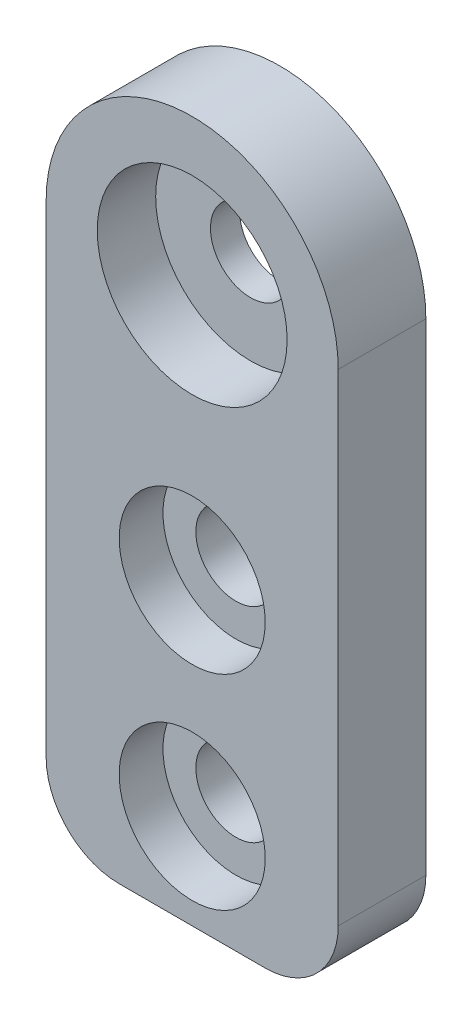
ISO-10303-21;
HEADER;
FILE_DESCRIPTION(('STEP AP214'),'2;1');
FILE_NAME('part.step','',(''),(''),'','','');
FILE_SCHEMA(('AUTOMOTIVE_DESIGN { 1 0 10303 214 1 1 1 1 }'));
ENDSEC;
DATA;
#1=APPLICATION_CONTEXT('core data for automotive mechanical design processes');
#2=APPLICATION_PROTOCOL_DEFINITION('international standard','automotive_design',2000,#1);
#3=PRODUCT_CONTEXT('',#1,'mechanical');
#4=PRODUCT('Part','Part','',(#3));
#5=PRODUCT_RELATED_PRODUCT_CATEGORY('part','',(#4));
#6=PRODUCT_DEFINITION_FORMATION('','',#4);
#7=PRODUCT_DEFINITION_CONTEXT('part definition',#1,'design');
#8=PRODUCT_DEFINITION('design','',#6,#7);
#9=PRODUCT_DEFINITION_SHAPE('','',#8);
#10=(LENGTH_UNIT() NAMED_UNIT(*) SI_UNIT(.MILLI.,.METRE.));
#11=(NAMED_UNIT(*) PLANE_ANGLE_UNIT() SI_UNIT($,.RADIAN.));
#12=(NAMED_UNIT(*) SI_UNIT($,.STERADIAN.) SOLID_ANGLE_UNIT());
#13=UNCERTAINTY_MEASURE_WITH_UNIT(LENGTH_MEASURE(1.E-05),#10,'distance_accuracy_value','');
#14=(GEOMETRIC_REPRESENTATION_CONTEXT(3) GLOBAL_UNCERTAINTY_ASSIGNED_CONTEXT((#13)) GLOBAL_UNIT_ASSIGNED_CONTEXT((#10,
#11,#12)) REPRESENTATION_CONTEXT('',''));
#15=CARTESIAN_POINT('',(0.,0.,0.));
#16=DIRECTION('',(0.,0.,1.));
#17=DIRECTION('',(1.,0.,0.));
#18=AXIS2_PLACEMENT_3D('',#15,#16,#17);
#19=CARTESIAN_POINT('',(0.,19.,6.));
#20=DIRECTION('',(0.,0.,-1.));
#21=DIRECTION('',(-1.,0.,0.));
#22=AXIS2_PLACEMENT_3D('',#19,#20,#21);
#23=CYLINDRICAL_SURFACE('',#22,2.75);
#24=CARTESIAN_POINT('',(0.,19.,0.));
#25=DIRECTION('',(0.,0.,1.));
#26=DIRECTION('',(1.,0.,0.));
#27=AXIS2_PLACEMENT_3D('',#24,#25,#26);
#28=CIRCLE('',#27,2.75);
#29=CARTESIAN_POINT('',(2.75,19.,0.));
#30=VERTEX_POINT('',#29);
#31=EDGE_CURVE('E130',#30,#30,#28,.T.);
#32=ORIENTED_EDGE('',*,*,#31,.F.);
#33=EDGE_LOOP('',(#32));
#34=FACE_BOUND('',#33,.T.);
#35=CARTESIAN_POINT('',(0.,19.,2.));
#36=DIRECTION('',(0.,0.,1.));
#37=DIRECTION('',(1.,0.,0.));
#38=AXIS2_PLACEMENT_3D('',#35,#36,#37);
#39=CIRCLE('',#38,2.75);
#40=CARTESIAN_POINT('',(2.75,19.,2.));
#41=VERTEX_POINT('',#40);
#42=EDGE_CURVE('E37',#41,#41,#39,.T.);
#43=ORIENTED_EDGE('',*,*,#42,.T.);
#44=EDGE_LOOP('',(#43));
#45=FACE_BOUND('',#44,.T.);
#46=ADVANCED_FACE('F33',(#34,#45),#23,.F.);
#47=CARTESIAN_POINT('',(0.,1.5,6.));
#48=DIRECTION('',(0.,0.,-1.));
#49=DIRECTION('',(-1.,0.,0.));
#50=AXIS2_PLACEMENT_3D('',#47,#48,#49);
#51=CYLINDRICAL_SURFACE('',#50,2.75);
#52=CARTESIAN_POINT('',(0.,1.5,0.));
#53=DIRECTION('',(0.,0.,1.));
#54=DIRECTION('',(1.,0.,0.));
#55=AXIS2_PLACEMENT_3D('',#52,#53,#54);
#56=CIRCLE('',#55,2.75);
#57=CARTESIAN_POINT('',(2.75,1.5,0.));
#58=VERTEX_POINT('',#57);
#59=EDGE_CURVE('E116',#58,#58,#56,.T.);
#60=ORIENTED_EDGE('',*,*,#59,.F.);
#61=EDGE_LOOP('',(#60));
#62=FACE_BOUND('',#61,.T.);
#63=CARTESIAN_POINT('',(0.,1.5,3.));
#64=DIRECTION('',(0.,0.,1.));
#65=DIRECTION('',(1.,0.,0.));
#66=AXIS2_PLACEMENT_3D('',#63,#64,#65);
#67=CIRCLE('',#66,2.75);
#68=CARTESIAN_POINT('',(2.75,1.5,3.));
#69=VERTEX_POINT('',#68);
#70=EDGE_CURVE('E126',#69,#69,#67,.T.);
#71=ORIENTED_EDGE('',*,*,#70,.T.);
#72=EDGE_LOOP('',(#71));
#73=FACE_BOUND('',#72,.T.);
#74=ADVANCED_FACE('F196',(#62,#73),#51,.F.);
#75=CARTESIAN_POINT('',(0.,-12.5,6.));
#76=DIRECTION('',(0.,0.,-1.));
#77=DIRECTION('',(-1.,0.,0.));
#78=AXIS2_PLACEMENT_3D('',#75,#76,#77);
#79=CYLINDRICAL_SURFACE('',#78,2.75);
#80=CARTESIAN_POINT('',(0.,-12.5,0.));
#81=DIRECTION('',(0.,0.,1.));
#82=DIRECTION('',(1.,0.,0.));
#83=AXIS2_PLACEMENT_3D('',#80,#81,#82);
#84=CIRCLE('',#83,2.75);
#85=CARTESIAN_POINT('',(2.75,-12.5,0.));
#86=VERTEX_POINT('',#85);
#87=EDGE_CURVE('E159',#86,#86,#84,.T.);
#88=ORIENTED_EDGE('',*,*,#87,.F.);
#89=EDGE_LOOP('',(#88));
#90=FACE_BOUND('',#89,.T.);
#91=CARTESIAN_POINT('',(0.,-12.5,3.));
#92=DIRECTION('',(0.,0.,1.));
#93=DIRECTION('',(1.,0.,0.));
#94=AXIS2_PLACEMENT_3D('',#91,#92,#93);
#95=CIRCLE('',#94,2.75);
#96=CARTESIAN_POINT('',(2.75,-12.5,3.));
#97=VERTEX_POINT('',#96);
#98=EDGE_CURVE('E123',#97,#97,#95,.T.);
#99=ORIENTED_EDGE('',*,*,#98,.T.);
#100=EDGE_LOOP('',(#99));
#101=FACE_BOUND('',#100,.T.);
#102=ADVANCED_FACE('F202',(#90,#101),#79,.F.);
#103=CARTESIAN_POINT('',(0.,19.,6.));
#104=DIRECTION('',(0.,0.,-1.));
#105=DIRECTION('',(-1.,0.,0.));
#106=AXIS2_PLACEMENT_3D('',#103,#104,#105);
#107=PLANE('',#106);
#108=CARTESIAN_POINT('',(0.,19.,6.));
#109=DIRECTION('',(0.,0.,1.));
#110=DIRECTION('',(1.,0.,0.));
#111=AXIS2_PLACEMENT_3D('',#108,#109,#110);
#112=CIRCLE('',#111,6.5);
#113=CARTESIAN_POINT('',(6.5,19.,6.));
#114=VERTEX_POINT('',#113);
#115=EDGE_CURVE('E175',#114,#114,#112,.T.);
#116=ORIENTED_EDGE('',*,*,#115,.F.);
#117=EDGE_LOOP('',(#116));
#118=FACE_BOUND('',#117,.T.);
#119=CARTESIAN_POINT('',(0.,1.5,6.));
#120=DIRECTION('',(0.,0.,1.));
#121=DIRECTION('',(1.,0.,0.));
#122=AXIS2_PLACEMENT_3D('',#119,#120,#121);
#123=CIRCLE('',#122,5.);
#124=CARTESIAN_POINT('',(5.,1.5,6.));
#125=VERTEX_POINT('',#124);
#126=EDGE_CURVE('E170',#125,#125,#123,.T.);
#127=ORIENTED_EDGE('',*,*,#126,.F.);
#128=EDGE_LOOP('',(#127));
#129=FACE_BOUND('',#128,.T.);
#130=CARTESIAN_POINT('',(0.,-12.5,6.));
#131=DIRECTION('',(0.,0.,1.));
#132=DIRECTION('',(1.,0.,0.));
#133=AXIS2_PLACEMENT_3D('',#130,#131,#132);
#134=CIRCLE('',#133,5.);
#135=CARTESIAN_POINT('',(5.,-12.5,6.));
#136=VERTEX_POINT('',#135);
#137=EDGE_CURVE('E164',#136,#136,#134,.T.);
#138=ORIENTED_EDGE('',*,*,#137,.F.);
#139=EDGE_LOOP('',(#138));
#140=FACE_BOUND('',#139,.T.);
#141=DIRECTION('',(0.,-1.,0.));
#142=VECTOR('',#141,1.);
#143=CARTESIAN_POINT('',(-9.99999999999999,19.,6.));
#144=LINE('',#143,#142);
#145=CARTESIAN_POINT('',(-9.99999999999999,19.,6.));
#146=VERTEX_POINT('',#145);
#147=CARTESIAN_POINT('',(-10.,-14.,6.));
#148=VERTEX_POINT('',#147);
#149=EDGE_CURVE('E121',#146,#148,#144,.T.);
#150=ORIENTED_EDGE('',*,*,#149,.T.);
#151=CARTESIAN_POINT('',(-5.,-14.,6.));
#152=DIRECTION('',(0.,0.,-1.));
#153=DIRECTION('',(-1.,0.,0.));
#154=AXIS2_PLACEMENT_3D('',#151,#152,#153);
#155=CIRCLE('',#154,5.);
#156=CARTESIAN_POINT('',(-5.,-19.,6.));
#157=VERTEX_POINT('',#156);
#158=EDGE_CURVE('E42',#148,#157,#155,.F.);
#159=ORIENTED_EDGE('',*,*,#158,.T.);
#160=DIRECTION('',(1.,0.,0.));
#161=VECTOR('',#160,1.);
#162=CARTESIAN_POINT('',(10.,-19.,6.));
#163=LINE('',#162,#161);
#164=CARTESIAN_POINT('',(5.,-19.,6.));
#165=VERTEX_POINT('',#164);
#166=EDGE_CURVE('E95',#157,#165,#163,.T.);
#167=ORIENTED_EDGE('',*,*,#166,.T.);
#168=CARTESIAN_POINT('',(5.,-14.,6.));
#169=DIRECTION('',(0.,0.,-1.));
#170=DIRECTION('',(-1.,0.,0.));
#171=AXIS2_PLACEMENT_3D('',#168,#169,#170);
#172=CIRCLE('',#171,5.);
#173=CARTESIAN_POINT('',(10.,-14.,6.));
#174=VERTEX_POINT('',#173);
#175=EDGE_CURVE('E49',#165,#174,#172,.F.);
#176=ORIENTED_EDGE('',*,*,#175,.T.);
#177=DIRECTION('',(0.,1.,0.));
#178=VECTOR('',#177,1.);
#179=CARTESIAN_POINT('',(9.99999999999999,19.,6.));
#180=LINE('',#179,#178);
#181=CARTESIAN_POINT('',(9.99999999999999,19.,6.));
#182=VERTEX_POINT('',#181);
#183=EDGE_CURVE('E87',#174,#182,#180,.T.);
#184=ORIENTED_EDGE('',*,*,#183,.T.);
#185=CARTESIAN_POINT('',(0.,19.,6.));
#186=DIRECTION('',(0.,0.,1.));
#187=DIRECTION('',(-1.,0.,0.));
#188=AXIS2_PLACEMENT_3D('',#185,#186,#187);
#189=CIRCLE('',#188,9.99999999999999);
#190=EDGE_CURVE('E91',#182,#146,#189,.T.);
#191=ORIENTED_EDGE('',*,*,#190,.T.);
#192=EDGE_LOOP('',(#150,#159,#167,#176,#184,#191));
#193=FACE_BOUND('',#192,.T.);
#194=ADVANCED_FACE('F89',(#118,#129,#140,#193),#107,.F.);
#195=CARTESIAN_POINT('',(0.,19.,0.));
#196=DIRECTION('',(0.,0.,-1.));
#197=DIRECTION('',(-1.,0.,0.));
#198=AXIS2_PLACEMENT_3D('',#195,#196,#197);
#199=PLANE('',#198);
#200=ORIENTED_EDGE('',*,*,#87,.T.);
#201=EDGE_LOOP('',(#200));
#202=FACE_BOUND('',#201,.T.);
#203=DIRECTION('',(1.,0.,0.));
#204=VECTOR('',#203,1.);
#205=CARTESIAN_POINT('',(10.,-19.,0.));
#206=LINE('',#205,#204);
#207=CARTESIAN_POINT('',(-5.,-19.,0.));
#208=VERTEX_POINT('',#207);
#209=CARTESIAN_POINT('',(5.,-19.,0.));
#210=VERTEX_POINT('',#209);
#211=EDGE_CURVE('E115',#208,#210,#206,.T.);
#212=ORIENTED_EDGE('',*,*,#211,.F.);
#213=CARTESIAN_POINT('',(-5.,-14.,0.));
#214=DIRECTION('',(0.,0.,-1.));
#215=DIRECTION('',(-1.,0.,0.));
#216=AXIS2_PLACEMENT_3D('',#213,#214,#215);
#217=CIRCLE('',#216,5.);
#218=CARTESIAN_POINT('',(-10.,-14.,0.));
#219=VERTEX_POINT('',#218);
#220=EDGE_CURVE('E137',#208,#219,#217,.T.);
#221=ORIENTED_EDGE('',*,*,#220,.T.);
#222=DIRECTION('',(0.,-1.,0.));
#223=VECTOR('',#222,1.);
#224=CARTESIAN_POINT('',(-9.99999999999999,19.,0.));
#225=LINE('',#224,#223);
#226=CARTESIAN_POINT('',(-9.99999999999999,19.,0.));
#227=VERTEX_POINT('',#226);
#228=EDGE_CURVE('E113',#227,#219,#225,.T.);
#229=ORIENTED_EDGE('',*,*,#228,.F.);
#230=CARTESIAN_POINT('',(0.,19.,0.));
#231=DIRECTION('',(0.,0.,1.));
#232=DIRECTION('',(-1.,0.,0.));
#233=AXIS2_PLACEMENT_3D('',#230,#231,#232);
#234=CIRCLE('',#233,9.99999999999999);
#235=CARTESIAN_POINT('',(9.99999999999999,19.,0.));
#236=VERTEX_POINT('',#235);
#237=EDGE_CURVE('E120',#236,#227,#234,.T.);
#238=ORIENTED_EDGE('',*,*,#237,.F.);
#239=DIRECTION('',(0.,1.,0.));
#240=VECTOR('',#239,1.);
#241=CARTESIAN_POINT('',(9.99999999999999,19.,0.));
#242=LINE('',#241,#240);
#243=CARTESIAN_POINT('',(10.,-14.,0.));
#244=VERTEX_POINT('',#243);
#245=EDGE_CURVE('E101',#244,#236,#242,.T.);
#246=ORIENTED_EDGE('',*,*,#245,.F.);
#247=CARTESIAN_POINT('',(5.,-14.,0.));
#248=DIRECTION('',(0.,0.,-1.));
#249=DIRECTION('',(-1.,0.,0.));
#250=AXIS2_PLACEMENT_3D('',#247,#248,#249);
#251=CIRCLE('',#250,5.);
#252=EDGE_CURVE('E135',#244,#210,#251,.T.);
#253=ORIENTED_EDGE('',*,*,#252,.T.);
#254=EDGE_LOOP('',(#212,#221,#229,#238,#246,#253));
#255=FACE_BOUND('',#254,.T.);
#256=ORIENTED_EDGE('',*,*,#59,.T.);
#257=EDGE_LOOP('',(#256));
#258=FACE_BOUND('',#257,.T.);
#259=ORIENTED_EDGE('',*,*,#31,.T.);
#260=EDGE_LOOP('',(#259));
#261=FACE_BOUND('',#260,.T.);
#262=ADVANCED_FACE('F152',(#202,#255,#258,#261),#199,.T.);
#263=CARTESIAN_POINT('',(-9.99999999999999,19.,6.));
#264=DIRECTION('',(1.,0.,0.));
#265=DIRECTION('',(0.,1.,0.));
#266=AXIS2_PLACEMENT_3D('',#263,#264,#265);
#267=PLANE('',#266);
#268=ORIENTED_EDGE('',*,*,#228,.T.);
#269=DIRECTION('',(0.,0.,-1.));
#270=VECTOR('',#269,1.);
#271=CARTESIAN_POINT('',(-10.,-14.,6.));
#272=LINE('',#271,#270);
#273=EDGE_CURVE('E57',#219,#148,#272,.F.);
#274=ORIENTED_EDGE('',*,*,#273,.T.);
#275=ORIENTED_EDGE('',*,*,#149,.F.);
#276=DIRECTION('',(0.,0.,-1.));
#277=VECTOR('',#276,1.);
#278=CARTESIAN_POINT('',(-9.99999999999999,19.,6.));
#279=LINE('',#278,#277);
#280=EDGE_CURVE('E105',#146,#227,#279,.T.);
#281=ORIENTED_EDGE('',*,*,#280,.T.);
#282=EDGE_LOOP('',(#268,#274,#275,#281));
#283=FACE_BOUND('',#282,.T.);
#284=ADVANCED_FACE('F154',(#283),#267,.F.);
#285=CARTESIAN_POINT('',(10.,-19.,6.));
#286=DIRECTION('',(0.,1.,0.));
#287=DIRECTION('',(-1.,0.,0.));
#288=AXIS2_PLACEMENT_3D('',#285,#286,#287);
#289=PLANE('',#288);
#290=ORIENTED_EDGE('',*,*,#166,.F.);
#291=DIRECTION('',(0.,0.,-1.));
#292=VECTOR('',#291,1.);
#293=CARTESIAN_POINT('',(-5.,-19.,6.));
#294=LINE('',#293,#292);
#295=EDGE_CURVE('E132',#157,#208,#294,.T.);
#296=ORIENTED_EDGE('',*,*,#295,.T.);
#297=ORIENTED_EDGE('',*,*,#211,.T.);
#298=DIRECTION('',(0.,0.,-1.));
#299=VECTOR('',#298,1.);
#300=CARTESIAN_POINT('',(5.,-19.,6.));
#301=LINE('',#300,#299);
#302=EDGE_CURVE('E104',#210,#165,#301,.F.);
#303=ORIENTED_EDGE('',*,*,#302,.T.);
#304=EDGE_LOOP('',(#290,#296,#297,#303));
#305=FACE_BOUND('',#304,.T.);
#306=ADVANCED_FACE('F146',(#305),#289,.F.);
#307=CARTESIAN_POINT('',(9.99999999999999,19.,6.));
#308=DIRECTION('',(-1.,0.,0.));
#309=DIRECTION('',(0.,-1.,0.));
#310=AXIS2_PLACEMENT_3D('',#307,#308,#309);
#311=PLANE('',#310);
#312=ORIENTED_EDGE('',*,*,#183,.F.);
#313=DIRECTION('',(0.,0.,-1.));
#314=VECTOR('',#313,1.);
#315=CARTESIAN_POINT('',(10.,-14.,6.));
#316=LINE('',#315,#314);
#317=EDGE_CURVE('E11',#174,#244,#316,.T.);
#318=ORIENTED_EDGE('',*,*,#317,.T.);
#319=ORIENTED_EDGE('',*,*,#245,.T.);
#320=DIRECTION('',(0.,0.,-1.));
#321=VECTOR('',#320,1.);
#322=CARTESIAN_POINT('',(9.99999999999999,19.,6.));
#323=LINE('',#322,#321);
#324=EDGE_CURVE('E98',#182,#236,#323,.T.);
#325=ORIENTED_EDGE('',*,*,#324,.F.);
#326=EDGE_LOOP('',(#312,#318,#319,#325));
#327=FACE_BOUND('',#326,.T.);
#328=ADVANCED_FACE('F99',(#327),#311,.F.);
#329=CARTESIAN_POINT('',(0.,19.,6.));
#330=DIRECTION('',(0.,0.,-1.));
#331=DIRECTION('',(-1.,0.,0.));
#332=AXIS2_PLACEMENT_3D('',#329,#330,#331);
#333=CYLINDRICAL_SURFACE('',#332,9.99999999999999);
#334=ORIENTED_EDGE('',*,*,#237,.T.);
#335=ORIENTED_EDGE('',*,*,#280,.F.);
#336=ORIENTED_EDGE('',*,*,#190,.F.);
#337=ORIENTED_EDGE('',*,*,#324,.T.);
#338=EDGE_LOOP('',(#334,#335,#336,#337));
#339=FACE_BOUND('',#338,.T.);
#340=ADVANCED_FACE('F107',(#339),#333,.T.);
#341=CARTESIAN_POINT('',(0.,-12.5,3.));
#342=DIRECTION('',(0.,0.,1.));
#343=DIRECTION('',(1.,0.,0.));
#344=AXIS2_PLACEMENT_3D('',#341,#342,#343);
#345=CYLINDRICAL_SURFACE('',#344,5.);
#346=CARTESIAN_POINT('',(0.,-12.5,3.));
#347=DIRECTION('',(0.,0.,1.));
#348=DIRECTION('',(1.,0.,0.));
#349=AXIS2_PLACEMENT_3D('',#346,#347,#348);
#350=CIRCLE('',#349,5.);
#351=CARTESIAN_POINT('',(5.,-12.5,3.));
#352=VERTEX_POINT('',#351);
#353=EDGE_CURVE('E167',#352,#352,#350,.T.);
#354=ORIENTED_EDGE('',*,*,#353,.F.);
#355=EDGE_LOOP('',(#354));
#356=FACE_BOUND('',#355,.T.);
#357=ORIENTED_EDGE('',*,*,#137,.T.);
#358=EDGE_LOOP('',(#357));
#359=FACE_BOUND('',#358,.T.);
#360=ADVANCED_FACE('F208',(#356,#359),#345,.F.);
#361=CARTESIAN_POINT('',(0.,-12.5,3.));
#362=DIRECTION('',(0.,0.,1.));
#363=DIRECTION('',(1.,0.,0.));
#364=AXIS2_PLACEMENT_3D('',#361,#362,#363);
#365=PLANE('',#364);
#366=ORIENTED_EDGE('',*,*,#98,.F.);
#367=EDGE_LOOP('',(#366));
#368=FACE_BOUND('',#367,.T.);
#369=ORIENTED_EDGE('',*,*,#353,.T.);
#370=EDGE_LOOP('',(#369));
#371=FACE_BOUND('',#370,.T.);
#372=ADVANCED_FACE('F239',(#368,#371),#365,.T.);
#373=CARTESIAN_POINT('',(0.,1.5,3.));
#374=DIRECTION('',(0.,0.,1.));
#375=DIRECTION('',(1.,0.,0.));
#376=AXIS2_PLACEMENT_3D('',#373,#374,#375);
#377=CYLINDRICAL_SURFACE('',#376,5.);
#378=CARTESIAN_POINT('',(0.,1.5,3.));
#379=DIRECTION('',(0.,0.,1.));
#380=DIRECTION('',(1.,0.,0.));
#381=AXIS2_PLACEMENT_3D('',#378,#379,#380);
#382=CIRCLE('',#381,5.);
#383=CARTESIAN_POINT('',(5.,1.5,3.));
#384=VERTEX_POINT('',#383);
#385=EDGE_CURVE('E127',#384,#384,#382,.T.);
#386=ORIENTED_EDGE('',*,*,#385,.F.);
#387=EDGE_LOOP('',(#386));
#388=FACE_BOUND('',#387,.T.);
#389=ORIENTED_EDGE('',*,*,#126,.T.);
#390=EDGE_LOOP('',(#389));
#391=FACE_BOUND('',#390,.T.);
#392=ADVANCED_FACE('F233',(#388,#391),#377,.F.);
#393=CARTESIAN_POINT('',(0.,1.5,3.));
#394=DIRECTION('',(0.,0.,1.));
#395=DIRECTION('',(1.,0.,0.));
#396=AXIS2_PLACEMENT_3D('',#393,#394,#395);
#397=PLANE('',#396);
#398=ORIENTED_EDGE('',*,*,#70,.F.);
#399=EDGE_LOOP('',(#398));
#400=FACE_BOUND('',#399,.T.);
#401=ORIENTED_EDGE('',*,*,#385,.T.);
#402=EDGE_LOOP('',(#401));
#403=FACE_BOUND('',#402,.T.);
#404=ADVANCED_FACE('F227',(#400,#403),#397,.T.);
#405=CARTESIAN_POINT('',(-5.,-14.,6.));
#406=DIRECTION('',(0.,0.,-1.));
#407=DIRECTION('',(-1.,0.,0.));
#408=AXIS2_PLACEMENT_3D('',#405,#406,#407);
#409=CYLINDRICAL_SURFACE('',#408,5.);
#410=ORIENTED_EDGE('',*,*,#158,.F.);
#411=ORIENTED_EDGE('',*,*,#273,.F.);
#412=ORIENTED_EDGE('',*,*,#220,.F.);
#413=ORIENTED_EDGE('',*,*,#295,.F.);
#414=EDGE_LOOP('',(#410,#411,#412,#413));
#415=FACE_BOUND('',#414,.T.);
#416=ADVANCED_FACE('F149',(#415),#409,.T.);
#417=CARTESIAN_POINT('',(5.,-14.,6.));
#418=DIRECTION('',(0.,0.,-1.));
#419=DIRECTION('',(-1.,0.,0.));
#420=AXIS2_PLACEMENT_3D('',#417,#418,#419);
#421=CYLINDRICAL_SURFACE('',#420,5.);
#422=ORIENTED_EDGE('',*,*,#175,.F.);
#423=ORIENTED_EDGE('',*,*,#302,.F.);
#424=ORIENTED_EDGE('',*,*,#252,.F.);
#425=ORIENTED_EDGE('',*,*,#317,.F.);
#426=EDGE_LOOP('',(#422,#423,#424,#425));
#427=FACE_BOUND('',#426,.T.);
#428=ADVANCED_FACE('F35',(#427),#421,.T.);
#429=CARTESIAN_POINT('',(0.,19.,2.));
#430=DIRECTION('',(0.,0.,1.));
#431=DIRECTION('',(1.,0.,0.));
#432=AXIS2_PLACEMENT_3D('',#429,#430,#431);
#433=CYLINDRICAL_SURFACE('',#432,6.5);
#434=CARTESIAN_POINT('',(0.,19.,2.));
#435=DIRECTION('',(0.,0.,1.));
#436=DIRECTION('',(1.,0.,0.));
#437=AXIS2_PLACEMENT_3D('',#434,#435,#436);
#438=CIRCLE('',#437,6.5);
#439=CARTESIAN_POINT('',(6.5,19.,2.));
#440=VERTEX_POINT('',#439);
#441=EDGE_CURVE('E178',#440,#440,#438,.T.);
#442=ORIENTED_EDGE('',*,*,#441,.F.);
#443=EDGE_LOOP('',(#442));
#444=FACE_BOUND('',#443,.T.);
#445=ORIENTED_EDGE('',*,*,#115,.T.);
#446=EDGE_LOOP('',(#445));
#447=FACE_BOUND('',#446,.T.);
#448=ADVANCED_FACE('F188',(#444,#447),#433,.F.);
#449=CARTESIAN_POINT('',(0.,19.,2.));
#450=DIRECTION('',(0.,0.,1.));
#451=DIRECTION('',(1.,0.,0.));
#452=AXIS2_PLACEMENT_3D('',#449,#450,#451);
#453=PLANE('',#452);
#454=ORIENTED_EDGE('',*,*,#42,.F.);
#455=EDGE_LOOP('',(#454));
#456=FACE_BOUND('',#455,.T.);
#457=ORIENTED_EDGE('',*,*,#441,.T.);
#458=EDGE_LOOP('',(#457));
#459=FACE_BOUND('',#458,.T.);
#460=ADVANCED_FACE('F186',(#456,#459),#453,.T.);
#461=CLOSED_SHELL('',(#46,#74,#102,#194,#262,#284,#306,#328,#340,#360,#372,#392,#404,#416,#428,
#448,#460));
#462=MANIFOLD_SOLID_BREP('B2',#461);
#463=ADVANCED_BREP_SHAPE_REPRESENTATION('',(#18,#462),#14);
#464=SHAPE_DEFINITION_REPRESENTATION(#9,#463);
ENDSEC;
END-ISO-10303-21;
